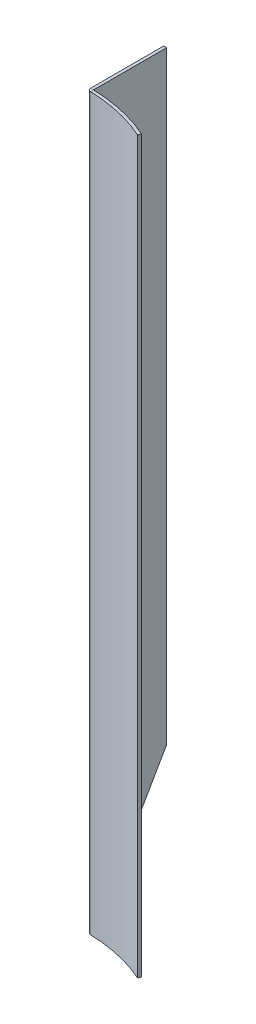
ISO-10303-21;
HEADER;
FILE_DESCRIPTION(('STEP AP214'),'2;1');
FILE_NAME('part.step','',(''),(''),'','','');
FILE_SCHEMA(('AUTOMOTIVE_DESIGN { 1 0 10303 214 1 1 1 1 }'));
ENDSEC;
DATA;
#1=APPLICATION_CONTEXT('core data for automotive mechanical design processes');
#2=APPLICATION_PROTOCOL_DEFINITION('international standard','automotive_design',2000,#1);
#3=PRODUCT_CONTEXT('',#1,'mechanical');
#4=PRODUCT('Part','Part','',(#3));
#5=PRODUCT_RELATED_PRODUCT_CATEGORY('part','',(#4));
#6=PRODUCT_DEFINITION_FORMATION('','',#4);
#7=PRODUCT_DEFINITION_CONTEXT('part definition',#1,'design');
#8=PRODUCT_DEFINITION('design','',#6,#7);
#9=PRODUCT_DEFINITION_SHAPE('','',#8);
#10=(LENGTH_UNIT() NAMED_UNIT(*) SI_UNIT(.MILLI.,.METRE.));
#11=(NAMED_UNIT(*) PLANE_ANGLE_UNIT() SI_UNIT($,.RADIAN.));
#12=(NAMED_UNIT(*) SI_UNIT($,.STERADIAN.) SOLID_ANGLE_UNIT());
#13=UNCERTAINTY_MEASURE_WITH_UNIT(LENGTH_MEASURE(1.E-05),#10,'distance_accuracy_value','');
#14=(GEOMETRIC_REPRESENTATION_CONTEXT(3) GLOBAL_UNCERTAINTY_ASSIGNED_CONTEXT((#13)) GLOBAL_UNIT_ASSIGNED_CONTEXT((#10,
#11,#12)) REPRESENTATION_CONTEXT('',''));
#15=CARTESIAN_POINT('',(0.,0.,0.));
#16=DIRECTION('',(0.,0.,1.));
#17=DIRECTION('',(1.,0.,0.));
#18=AXIS2_PLACEMENT_3D('',#15,#16,#17);
#19=CARTESIAN_POINT('',(-19.5467203252553,381.,22.8059975296282));
#20=DIRECTION('',(-1.,0.,0.));
#21=DIRECTION('',(0.,0.,1.));
#22=AXIS2_PLACEMENT_3D('',#19,#20,#21);
#23=PLANE('',#22);
#24=DIRECTION('',(0.,-0.866025403784437,0.500000000000004));
#25=VECTOR('',#24,1.);
#26=CARTESIAN_POINT('',(-19.5467203252553,0.,22.8059975296282));
#27=LINE('',#26,#25);
#28=CARTESIAN_POINT('',(-19.5467203252553,65.9911357683736,-15.2940024703718));
#29=VERTEX_POINT('',#28);
#30=CARTESIAN_POINT('',(-19.5467203252553,0.,22.8059975296282));
#31=VERTEX_POINT('',#30);
#32=EDGE_CURVE('E86',#29,#31,#27,.T.);
#33=ORIENTED_EDGE('',*,*,#32,.F.);
#34=DIRECTION('',(0.,-1.,0.));
#35=VECTOR('',#34,1.);
#36=CARTESIAN_POINT('',(-19.5467203252553,381.,-15.2940024703718));
#37=LINE('',#36,#35);
#38=CARTESIAN_POINT('',(-19.5467203252553,381.,-15.2940024703718));
#39=VERTEX_POINT('',#38);
#40=EDGE_CURVE('E196',#39,#29,#37,.T.);
#41=ORIENTED_EDGE('',*,*,#40,.F.);
#42=DIRECTION('',(0.,0.,-1.));
#43=VECTOR('',#42,1.);
#44=CARTESIAN_POINT('',(-19.5467203252553,381.,22.8059975296282));
#45=LINE('',#44,#43);
#46=CARTESIAN_POINT('',(-19.5467203252553,381.,22.8059975296282));
#47=VERTEX_POINT('',#46);
#48=EDGE_CURVE('E92',#47,#39,#45,.T.);
#49=ORIENTED_EDGE('',*,*,#48,.F.);
#50=DIRECTION('',(0.,-1.,0.));
#51=VECTOR('',#50,1.);
#52=CARTESIAN_POINT('',(-19.5467203252553,381.,22.8059975296282));
#53=LINE('',#52,#51);
#54=EDGE_CURVE('E156',#47,#31,#53,.T.);
#55=ORIENTED_EDGE('',*,*,#54,.T.);
#56=EDGE_LOOP('',(#33,#41,#49,#55));
#57=FACE_BOUND('',#56,.T.);
#58=ADVANCED_FACE('F36',(#57),#23,.F.);
#59=CARTESIAN_POINT('',(-21.0707203252553,381.,-15.2940024703718));
#60=DIRECTION('',(0.,0.,-1.));
#61=DIRECTION('',(-1.,0.,0.));
#62=AXIS2_PLACEMENT_3D('',#59,#60,#61);
#63=PLANE('',#62);
#64=ORIENTED_EDGE('',*,*,#40,.T.);
#65=DIRECTION('',(1.,0.,0.));
#66=VECTOR('',#65,1.);
#67=CARTESIAN_POINT('',(-19.5467203252553,65.9911357683736,-15.2940024703718));
#68=LINE('',#67,#66);
#69=CARTESIAN_POINT('',(-21.0707203252553,65.9911357683736,-15.2940024703718));
#70=VERTEX_POINT('',#69);
#71=EDGE_CURVE('E164',#29,#70,#68,.F.);
#72=ORIENTED_EDGE('',*,*,#71,.T.);
#73=DIRECTION('',(0.,-1.,0.));
#74=VECTOR('',#73,1.);
#75=CARTESIAN_POINT('',(-21.0707203252553,381.,-15.2940024703718));
#76=LINE('',#75,#74);
#77=CARTESIAN_POINT('',(-21.0707203252553,381.,-15.2940024703718));
#78=VERTEX_POINT('',#77);
#79=EDGE_CURVE('E193',#78,#70,#76,.T.);
#80=ORIENTED_EDGE('',*,*,#79,.F.);
#81=DIRECTION('',(1.,0.,0.));
#82=VECTOR('',#81,1.);
#83=CARTESIAN_POINT('',(-21.0707203252553,381.,-15.2940024703718));
#84=LINE('',#83,#82);
#85=EDGE_CURVE('E230',#78,#39,#84,.T.);
#86=ORIENTED_EDGE('',*,*,#85,.T.);
#87=EDGE_LOOP('',(#64,#72,#80,#86));
#88=FACE_BOUND('',#87,.T.);
#89=ADVANCED_FACE('F252',(#88),#63,.T.);
#90=CARTESIAN_POINT('',(-21.0707203252553,381.,22.8059975296282));
#91=DIRECTION('',(-1.,0.,0.));
#92=DIRECTION('',(0.,0.,1.));
#93=AXIS2_PLACEMENT_3D('',#90,#91,#92);
#94=PLANE('',#93);
#95=ORIENTED_EDGE('',*,*,#79,.T.);
#96=DIRECTION('',(0.,-0.866025403784437,0.500000000000004));
#97=VECTOR('',#96,1.);
#98=CARTESIAN_POINT('',(-21.0707203252553,0.,22.8059975296282));
#99=LINE('',#98,#97);
#100=CARTESIAN_POINT('',(-21.0707203252553,0.,22.8059975296282));
#101=VERTEX_POINT('',#100);
#102=EDGE_CURVE('E205',#70,#101,#99,.T.);
#103=ORIENTED_EDGE('',*,*,#102,.T.);
#104=DIRECTION('',(0.,-1.,0.));
#105=VECTOR('',#104,1.);
#106=CARTESIAN_POINT('',(-21.0707203252553,381.,22.8059975296282));
#107=LINE('',#106,#105);
#108=CARTESIAN_POINT('',(-21.0707203252553,381.,22.8059975296282));
#109=VERTEX_POINT('',#108);
#110=EDGE_CURVE('E190',#109,#101,#107,.T.);
#111=ORIENTED_EDGE('',*,*,#110,.F.);
#112=DIRECTION('',(0.,0.,-1.));
#113=VECTOR('',#112,1.);
#114=CARTESIAN_POINT('',(-21.0707203252553,381.,22.8059975296282));
#115=LINE('',#114,#113);
#116=EDGE_CURVE('E226',#109,#78,#115,.T.);
#117=ORIENTED_EDGE('',*,*,#116,.T.);
#118=EDGE_LOOP('',(#95,#103,#111,#117));
#119=FACE_BOUND('',#118,.T.);
#120=ADVANCED_FACE('F211',(#119),#94,.T.);
#121=CARTESIAN_POINT('',(-21.0707203252553,381.,22.8059975296282));
#122=DIRECTION('',(0.,1.,0.));
#123=DIRECTION('',(0.,0.,1.));
#124=AXIS2_PLACEMENT_3D('',#121,#122,#123);
#125=PLANE('',#124);
#126=DIRECTION('',(1.,0.,0.));
#127=VECTOR('',#126,1.);
#128=CARTESIAN_POINT('',(-21.0707203252553,381.,22.8059975296282));
#129=LINE('',#128,#127);
#130=EDGE_CURVE('E11',#109,#47,#129,.T.);
#131=ORIENTED_EDGE('',*,*,#130,.F.);
#132=CARTESIAN_POINT('',(-19.4832203252553,381.,22.8059975296282));
#133=DIRECTION('',(0.,-1.,0.));
#134=DIRECTION('',(0.,0.,1.));
#135=AXIS2_PLACEMENT_3D('',#132,#133,#134);
#136=CIRCLE('',#135,1.58750000000001);
#137=CARTESIAN_POINT('',(-19.5173130058341,381.,24.3931314052452));
#138=VERTEX_POINT('',#137);
#139=EDGE_CURVE('E220',#138,#109,#136,.T.);
#140=ORIENTED_EDGE('',*,*,#139,.F.);
#141=DIRECTION('',(0.0214757043016455,0.,-0.999769370467384));
#142=VECTOR('',#141,1.);
#143=CARTESIAN_POINT('',(-19.5173130058341,381.,24.3931314052452));
#144=LINE('',#143,#142);
#145=CARTESIAN_POINT('',(-19.4845840324784,381.,22.8694828846529));
#146=VERTEX_POINT('',#145);
#147=EDGE_CURVE('E129',#138,#146,#144,.T.);
#148=ORIENTED_EDGE('',*,*,#147,.T.);
#149=CARTESIAN_POINT('',(-19.4832203252553,381.,22.8059975296282));
#150=DIRECTION('',(0.,1.,0.));
#151=DIRECTION('',(1.,0.,0.));
#152=AXIS2_PLACEMENT_3D('',#149,#150,#151);
#153=CIRCLE('',#152,0.0635000000000123);
#154=EDGE_CURVE('E154',#146,#47,#153,.F.);
#155=ORIENTED_EDGE('',*,*,#154,.T.);
#156=EDGE_LOOP('',(#131,#140,#148,#155));
#157=FACE_BOUND('',#156,.T.);
#158=ADVANCED_FACE('F38',(#157),#125,.T.);
#159=CARTESIAN_POINT('',(-19.5467203252553,0.,22.8059975296282));
#160=DIRECTION('',(0.,-1.,0.));
#161=DIRECTION('',(0.,0.,-1.));
#162=AXIS2_PLACEMENT_3D('',#159,#160,#161);
#163=PLANE('',#162);
#164=DIRECTION('',(-1.,0.,0.));
#165=VECTOR('',#164,1.);
#166=CARTESIAN_POINT('',(-19.5467203252553,0.,22.8059975296282));
#167=LINE('',#166,#165);
#168=EDGE_CURVE('E45',#31,#101,#167,.T.);
#169=ORIENTED_EDGE('',*,*,#168,.F.);
#170=CARTESIAN_POINT('',(-19.4832203252553,0.,22.8059975296282));
#171=DIRECTION('',(0.,1.,0.));
#172=DIRECTION('',(1.,0.,0.));
#173=AXIS2_PLACEMENT_3D('',#170,#171,#172);
#174=CIRCLE('',#173,0.0635000000000123);
#175=CARTESIAN_POINT('',(-19.4845840324784,0.,22.8694828846529));
#176=VERTEX_POINT('',#175);
#177=EDGE_CURVE('E175',#176,#31,#174,.F.);
#178=ORIENTED_EDGE('',*,*,#177,.F.);
#179=DIRECTION('',(-0.0214757043016455,0.,0.999769370467384));
#180=VECTOR('',#179,1.);
#181=CARTESIAN_POINT('',(-19.4845840324784,0.,22.8694828846529));
#182=LINE('',#181,#180);
#183=CARTESIAN_POINT('',(-19.5173130058341,0.,24.3931314052452));
#184=VERTEX_POINT('',#183);
#185=EDGE_CURVE('E78',#176,#184,#182,.T.);
#186=ORIENTED_EDGE('',*,*,#185,.T.);
#187=CARTESIAN_POINT('',(-19.4832203252553,0.,22.8059975296282));
#188=DIRECTION('',(0.,-1.,0.));
#189=DIRECTION('',(0.,0.,1.));
#190=AXIS2_PLACEMENT_3D('',#187,#188,#189);
#191=CIRCLE('',#190,1.58750000000001);
#192=EDGE_CURVE('E160',#184,#101,#191,.T.);
#193=ORIENTED_EDGE('',*,*,#192,.T.);
#194=EDGE_LOOP('',(#169,#178,#186,#193));
#195=FACE_BOUND('',#194,.T.);
#196=ADVANCED_FACE('F221',(#195),#163,.T.);
#197=CARTESIAN_POINT('',(-19.5173130058341,381.,24.3931314052452));
#198=DIRECTION('',(0.,1.,0.));
#199=DIRECTION('',(0.,0.,1.));
#200=AXIS2_PLACEMENT_3D('',#197,#198,#199);
#201=PLANE('',#200);
#202=ORIENTED_EDGE('',*,*,#147,.F.);
#203=CARTESIAN_POINT('',(-19.551405686413,381.,25.9802652808622));
#204=DIRECTION('',(0.,1.,0.));
#205=DIRECTION('',(0.,0.,1.));
#206=AXIS2_PLACEMENT_3D('',#203,#204,#205);
#207=CIRCLE('',#206,1.5875);
#208=CARTESIAN_POINT('',(-19.5061822873051,381.,24.3934095551666));
#209=VERTEX_POINT('',#208);
#210=EDGE_CURVE('E124',#209,#138,#207,.T.);
#211=ORIENTED_EDGE('',*,*,#210,.F.);
#212=DIRECTION('',(-0.0284871805403757,0.,0.999594157918532));
#213=VECTOR('',#212,1.);
#214=CARTESIAN_POINT('',(-19.4627678241616,381.,22.8700280584987));
#215=LINE('',#214,#213);
#216=CARTESIAN_POINT('',(-19.4627678241616,381.,22.8700280584987));
#217=VERTEX_POINT('',#216);
#218=EDGE_CURVE('E117',#217,#209,#215,.T.);
#219=ORIENTED_EDGE('',*,*,#218,.F.);
#220=CARTESIAN_POINT('',(-19.551405686413,381.,25.9802652808622));
#221=DIRECTION('',(0.,1.,0.));
#222=DIRECTION('',(1.,0.,0.));
#223=AXIS2_PLACEMENT_3D('',#220,#221,#222);
#224=CIRCLE('',#223,3.1115);
#225=EDGE_CURVE('E121',#217,#146,#224,.T.);
#226=ORIENTED_EDGE('',*,*,#225,.T.);
#227=EDGE_LOOP('',(#202,#211,#219,#226));
#228=FACE_BOUND('',#227,.T.);
#229=ADVANCED_FACE('F119',(#228),#201,.T.);
#230=CARTESIAN_POINT('',(-19.4627678241616,381.,22.8700280584987));
#231=DIRECTION('',(0.,1.,0.));
#232=DIRECTION('',(0.,0.,1.));
#233=AXIS2_PLACEMENT_3D('',#230,#231,#232);
#234=PLANE('',#233);
#235=ORIENTED_EDGE('',*,*,#116,.F.);
#236=ORIENTED_EDGE('',*,*,#130,.T.);
#237=ORIENTED_EDGE('',*,*,#48,.T.);
#238=ORIENTED_EDGE('',*,*,#85,.F.);
#239=EDGE_LOOP('',(#235,#236,#237,#238));
#240=FACE_BOUND('',#239,.T.);
#241=ADVANCED_FACE('F266',(#240),#234,.T.);
#242=CARTESIAN_POINT('',(-19.5061822873051,0.,24.3934095551666));
#243=DIRECTION('',(0.,-1.,0.));
#244=DIRECTION('',(0.,0.,-1.));
#245=AXIS2_PLACEMENT_3D('',#242,#243,#244);
#246=PLANE('',#245);
#247=DIRECTION('',(0.0284871805403757,0.,-0.999594157918532));
#248=VECTOR('',#247,1.);
#249=CARTESIAN_POINT('',(-19.5061822873051,0.,24.3934095551666));
#250=LINE('',#249,#248);
#251=CARTESIAN_POINT('',(-19.5061822873051,0.,24.3934095551666));
#252=VERTEX_POINT('',#251);
#253=CARTESIAN_POINT('',(-19.4627678241616,0.,22.8700280584987));
#254=VERTEX_POINT('',#253);
#255=EDGE_CURVE('E130',#252,#254,#250,.T.);
#256=ORIENTED_EDGE('',*,*,#255,.F.);
#257=CARTESIAN_POINT('',(-19.551405686413,0.,25.9802652808622));
#258=DIRECTION('',(0.,1.,0.));
#259=DIRECTION('',(0.,0.,1.));
#260=AXIS2_PLACEMENT_3D('',#257,#258,#259);
#261=CIRCLE('',#260,1.5875);
#262=EDGE_CURVE('E163',#252,#184,#261,.T.);
#263=ORIENTED_EDGE('',*,*,#262,.T.);
#264=ORIENTED_EDGE('',*,*,#185,.F.);
#265=CARTESIAN_POINT('',(-19.551405686413,0.,25.9802652808622));
#266=DIRECTION('',(0.,1.,0.));
#267=DIRECTION('',(1.,0.,0.));
#268=AXIS2_PLACEMENT_3D('',#265,#266,#267);
#269=CIRCLE('',#268,3.1115);
#270=EDGE_CURVE('E173',#254,#176,#269,.T.);
#271=ORIENTED_EDGE('',*,*,#270,.F.);
#272=EDGE_LOOP('',(#256,#263,#264,#271));
#273=FACE_BOUND('',#272,.T.);
#274=ADVANCED_FACE('F240',(#273),#246,.T.);
#275=CARTESIAN_POINT('',(-19.4845840324784,0.,22.8694828846529));
#276=DIRECTION('',(0.,-1.,0.));
#277=DIRECTION('',(0.,0.,-1.));
#278=AXIS2_PLACEMENT_3D('',#275,#276,#277);
#279=PLANE('',#278);
#280=CARTESIAN_POINT('',(-21.8939777601995,0.,108.179391871898));
#281=DIRECTION('',(0.,1.,0.));
#282=DIRECTION('',(0.,0.,1.));
#283=AXIS2_PLACEMENT_3D('',#280,#281,#282);
#284=CIRCLE('',#283,83.82);
#285=CARTESIAN_POINT('',(12.2372722398005,0.,31.6232022237872));
#286=VERTEX_POINT('',#285);
#287=EDGE_CURVE('E166',#286,#252,#284,.T.);
#288=ORIENTED_EDGE('',*,*,#287,.T.);
#289=ORIENTED_EDGE('',*,*,#255,.T.);
#290=CARTESIAN_POINT('',(-21.8939777601995,0.,108.179391871898));
#291=DIRECTION('',(0.,1.,0.));
#292=DIRECTION('',(1.,0.,0.));
#293=AXIS2_PLACEMENT_3D('',#290,#291,#292);
#294=CIRCLE('',#293,85.344);
#295=CARTESIAN_POINT('',(12.8578404216187,0.,30.2312715029125));
#296=VERTEX_POINT('',#295);
#297=EDGE_CURVE('E146',#296,#254,#294,.T.);
#298=ORIENTED_EDGE('',*,*,#297,.F.);
#299=DIRECTION('',(-0.407196969696981,0.,0.91334036802804));
#300=VECTOR('',#299,1.);
#301=CARTESIAN_POINT('',(12.8578404216187,0.,30.2312715029125));
#302=LINE('',#301,#300);
#303=EDGE_CURVE('E169',#296,#286,#302,.T.);
#304=ORIENTED_EDGE('',*,*,#303,.T.);
#305=EDGE_LOOP('',(#288,#289,#298,#304));
#306=FACE_BOUND('',#305,.T.);
#307=ADVANCED_FACE('F239',(#306),#279,.T.);
#308=CARTESIAN_POINT('',(-19.4832203252553,381.,22.8059975296282));
#309=DIRECTION('',(0.,-1.,0.));
#310=DIRECTION('',(0.,0.,-1.));
#311=AXIS2_PLACEMENT_3D('',#308,#309,#310);
#312=CYLINDRICAL_SURFACE('',#311,1.58750000000001);
#313=ORIENTED_EDGE('',*,*,#192,.F.);
#314=DIRECTION('',(0.,-1.,0.));
#315=VECTOR('',#314,1.);
#316=CARTESIAN_POINT('',(-19.5173130058341,381.,24.3931314052452));
#317=LINE('',#316,#315);
#318=EDGE_CURVE('E187',#138,#184,#317,.T.);
#319=ORIENTED_EDGE('',*,*,#318,.F.);
#320=ORIENTED_EDGE('',*,*,#139,.T.);
#321=ORIENTED_EDGE('',*,*,#110,.T.);
#322=EDGE_LOOP('',(#313,#319,#320,#321));
#323=FACE_BOUND('',#322,.T.);
#324=ADVANCED_FACE('F217',(#323),#312,.T.);
#325=CARTESIAN_POINT('',(-19.551405686413,381.,25.9802652808622));
#326=DIRECTION('',(0.,-1.,0.));
#327=DIRECTION('',(0.,0.,-1.));
#328=AXIS2_PLACEMENT_3D('',#325,#326,#327);
#329=CYLINDRICAL_SURFACE('',#328,1.5875);
#330=ORIENTED_EDGE('',*,*,#262,.F.);
#331=DIRECTION('',(0.,-1.,0.));
#332=VECTOR('',#331,1.);
#333=CARTESIAN_POINT('',(-19.5061822873051,381.,24.3934095551666));
#334=LINE('',#333,#332);
#335=EDGE_CURVE('E184',#209,#252,#334,.T.);
#336=ORIENTED_EDGE('',*,*,#335,.F.);
#337=ORIENTED_EDGE('',*,*,#210,.T.);
#338=ORIENTED_EDGE('',*,*,#318,.T.);
#339=EDGE_LOOP('',(#330,#336,#337,#338));
#340=FACE_BOUND('',#339,.T.);
#341=ADVANCED_FACE('F224',(#340),#329,.F.);
#342=CARTESIAN_POINT('',(-21.8939777601995,381.,108.179391871898));
#343=DIRECTION('',(0.,-1.,0.));
#344=DIRECTION('',(0.,0.,-1.));
#345=AXIS2_PLACEMENT_3D('',#342,#343,#344);
#346=CYLINDRICAL_SURFACE('',#345,83.82);
#347=ORIENTED_EDGE('',*,*,#287,.F.);
#348=DIRECTION('',(0.,-1.,0.));
#349=VECTOR('',#348,1.);
#350=CARTESIAN_POINT('',(12.2372722398005,381.,31.6232022237872));
#351=LINE('',#350,#349);
#352=CARTESIAN_POINT('',(12.2372722398005,381.,31.6232022237872));
#353=VERTEX_POINT('',#352);
#354=EDGE_CURVE('E182',#353,#286,#351,.T.);
#355=ORIENTED_EDGE('',*,*,#354,.F.);
#356=CARTESIAN_POINT('',(-21.8939777601995,381.,108.179391871898));
#357=DIRECTION('',(0.,1.,0.));
#358=DIRECTION('',(0.,0.,1.));
#359=AXIS2_PLACEMENT_3D('',#356,#357,#358);
#360=CIRCLE('',#359,83.82);
#361=EDGE_CURVE('E228',#353,#209,#360,.T.);
#362=ORIENTED_EDGE('',*,*,#361,.T.);
#363=ORIENTED_EDGE('',*,*,#335,.T.);
#364=EDGE_LOOP('',(#347,#355,#362,#363));
#365=FACE_BOUND('',#364,.T.);
#366=ADVANCED_FACE('F242',(#365),#346,.F.);
#367=CARTESIAN_POINT('',(12.8578404216187,381.,30.2312715029125));
#368=DIRECTION('',(0.91334036802804,0.,0.407196969696982));
#369=DIRECTION('',(0.407196969696982,0.,-0.91334036802804));
#370=AXIS2_PLACEMENT_3D('',#367,#368,#369);
#371=PLANE('',#370);
#372=ORIENTED_EDGE('',*,*,#303,.F.);
#373=DIRECTION('',(0.,-1.,0.));
#374=VECTOR('',#373,1.);
#375=CARTESIAN_POINT('',(12.8578404216187,381.,30.2312715029125));
#376=LINE('',#375,#374);
#377=CARTESIAN_POINT('',(12.8578404216187,381.,30.2312715029125));
#378=VERTEX_POINT('',#377);
#379=EDGE_CURVE('E148',#378,#296,#376,.T.);
#380=ORIENTED_EDGE('',*,*,#379,.F.);
#381=DIRECTION('',(-0.407196969696981,0.,0.91334036802804));
#382=VECTOR('',#381,1.);
#383=CARTESIAN_POINT('',(12.8578404216187,381.,30.2312715029125));
#384=LINE('',#383,#382);
#385=EDGE_CURVE('E138',#378,#353,#384,.T.);
#386=ORIENTED_EDGE('',*,*,#385,.T.);
#387=ORIENTED_EDGE('',*,*,#354,.T.);
#388=EDGE_LOOP('',(#372,#380,#386,#387));
#389=FACE_BOUND('',#388,.T.);
#390=ADVANCED_FACE('F236',(#389),#371,.T.);
#391=CARTESIAN_POINT('',(-21.8939777601995,381.,108.179391871898));
#392=DIRECTION('',(0.,-1.,0.));
#393=DIRECTION('',(0.,0.,-1.));
#394=AXIS2_PLACEMENT_3D('',#391,#392,#393);
#395=CYLINDRICAL_SURFACE('',#394,85.344);
#396=ORIENTED_EDGE('',*,*,#297,.T.);
#397=DIRECTION('',(0.,-1.,0.));
#398=VECTOR('',#397,1.);
#399=CARTESIAN_POINT('',(-19.4627678241616,381.,22.8700280584987));
#400=LINE('',#399,#398);
#401=EDGE_CURVE('E143',#217,#254,#400,.T.);
#402=ORIENTED_EDGE('',*,*,#401,.F.);
#403=CARTESIAN_POINT('',(-21.8939777601995,381.,108.179391871898));
#404=DIRECTION('',(0.,1.,0.));
#405=DIRECTION('',(1.,0.,0.));
#406=AXIS2_PLACEMENT_3D('',#403,#404,#405);
#407=CIRCLE('',#406,85.344);
#408=EDGE_CURVE('E134',#378,#217,#407,.T.);
#409=ORIENTED_EDGE('',*,*,#408,.F.);
#410=ORIENTED_EDGE('',*,*,#379,.T.);
#411=EDGE_LOOP('',(#396,#402,#409,#410));
#412=FACE_BOUND('',#411,.T.);
#413=ADVANCED_FACE('F144',(#412),#395,.T.);
#414=CARTESIAN_POINT('',(-19.551405686413,381.,25.9802652808622));
#415=DIRECTION('',(0.,-1.,0.));
#416=DIRECTION('',(0.,0.,-1.));
#417=AXIS2_PLACEMENT_3D('',#414,#415,#416);
#418=CYLINDRICAL_SURFACE('',#417,3.1115);
#419=ORIENTED_EDGE('',*,*,#270,.T.);
#420=DIRECTION('',(0.,-1.,0.));
#421=VECTOR('',#420,1.);
#422=CARTESIAN_POINT('',(-19.4845840324784,381.,22.8694828846529));
#423=LINE('',#422,#421);
#424=EDGE_CURVE('E149',#146,#176,#423,.T.);
#425=ORIENTED_EDGE('',*,*,#424,.F.);
#426=ORIENTED_EDGE('',*,*,#225,.F.);
#427=ORIENTED_EDGE('',*,*,#401,.T.);
#428=EDGE_LOOP('',(#419,#425,#426,#427));
#429=FACE_BOUND('',#428,.T.);
#430=ADVANCED_FACE('F151',(#429),#418,.T.);
#431=CARTESIAN_POINT('',(-19.4832203252553,381.,22.8059975296282));
#432=DIRECTION('',(0.,-1.,0.));
#433=DIRECTION('',(0.,0.,-1.));
#434=AXIS2_PLACEMENT_3D('',#431,#432,#433);
#435=CYLINDRICAL_SURFACE('',#434,0.0635000000000123);
#436=ORIENTED_EDGE('',*,*,#177,.T.);
#437=ORIENTED_EDGE('',*,*,#54,.F.);
#438=ORIENTED_EDGE('',*,*,#154,.F.);
#439=ORIENTED_EDGE('',*,*,#424,.T.);
#440=EDGE_LOOP('',(#436,#437,#438,#439));
#441=FACE_BOUND('',#440,.T.);
#442=ADVANCED_FACE('F324',(#441),#435,.F.);
#443=CARTESIAN_POINT('',(-19.4832203252553,381.,22.8059975296282));
#444=DIRECTION('',(0.,-1.,0.));
#445=DIRECTION('',(-1.,0.,0.));
#446=AXIS2_PLACEMENT_3D('',#443,#444,#445);
#447=PLANE('',#446);
#448=ORIENTED_EDGE('',*,*,#408,.T.);
#449=ORIENTED_EDGE('',*,*,#218,.T.);
#450=ORIENTED_EDGE('',*,*,#361,.F.);
#451=ORIENTED_EDGE('',*,*,#385,.F.);
#452=EDGE_LOOP('',(#448,#449,#450,#451));
#453=FACE_BOUND('',#452,.T.);
#454=ADVANCED_FACE('F136',(#453),#447,.F.);
#455=CARTESIAN_POINT('',(-19.5467203252553,0.,22.8059975296282));
#456=DIRECTION('',(0.,-0.500000000000004,-0.866025403784437));
#457=DIRECTION('',(0.,-0.866025403784437,0.500000000000004));
#458=AXIS2_PLACEMENT_3D('',#455,#456,#457);
#459=PLANE('',#458);
#460=ORIENTED_EDGE('',*,*,#71,.F.);
#461=ORIENTED_EDGE('',*,*,#32,.T.);
#462=ORIENTED_EDGE('',*,*,#168,.T.);
#463=ORIENTED_EDGE('',*,*,#102,.F.);
#464=EDGE_LOOP('',(#460,#461,#462,#463));
#465=FACE_BOUND('',#464,.T.);
#466=ADVANCED_FACE('F204',(#465),#459,.T.);
#467=CLOSED_SHELL('',(#58,#89,#120,#158,#196,#229,#241,#274,#307,#324,#341,#366,#390,#413,#430,
#442,#454,#466));
#468=MANIFOLD_SOLID_BREP('B2',#467);
#469=ADVANCED_BREP_SHAPE_REPRESENTATION('',(#18,#468),#14);
#470=SHAPE_DEFINITION_REPRESENTATION(#9,#469);
ENDSEC;
END-ISO-10303-21;
